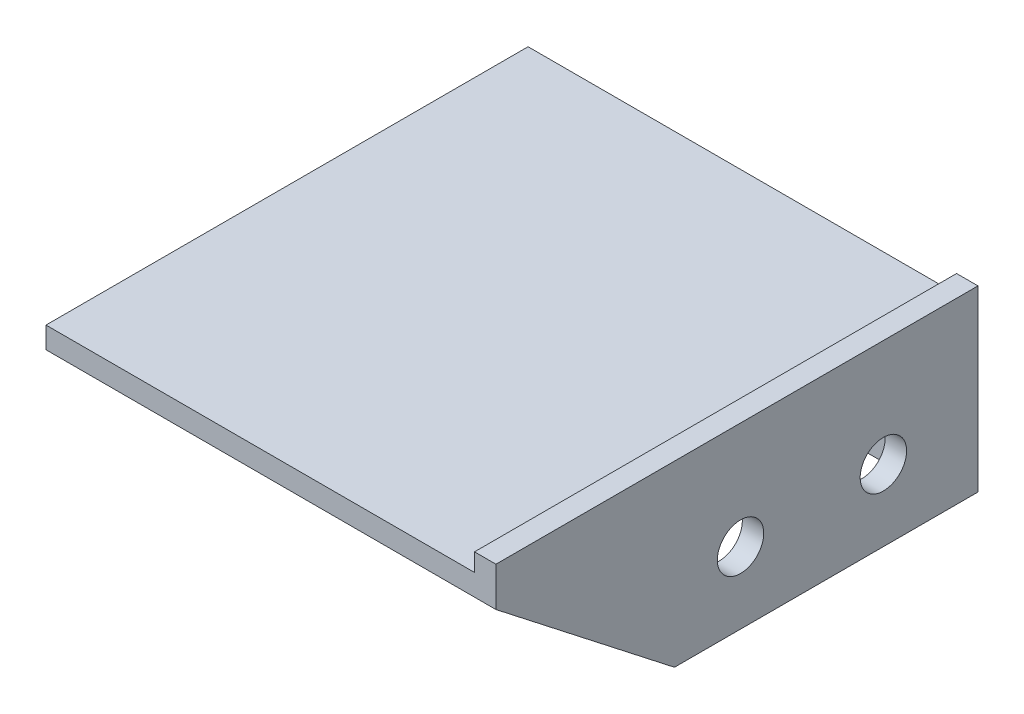
ISO-10303-21;
HEADER;
FILE_DESCRIPTION(('STEP AP214'),'2;1');
FILE_NAME('part.step','',(''),(''),'','','');
FILE_SCHEMA(('AUTOMOTIVE_DESIGN { 1 0 10303 214 1 1 1 1 }'));
ENDSEC;
DATA;
#1=APPLICATION_CONTEXT('core data for automotive mechanical design processes');
#2=APPLICATION_PROTOCOL_DEFINITION('international standard','automotive_design',2000,#1);
#3=PRODUCT_CONTEXT('',#1,'mechanical');
#4=PRODUCT('Part','Part','',(#3));
#5=PRODUCT_RELATED_PRODUCT_CATEGORY('part','',(#4));
#6=PRODUCT_DEFINITION_FORMATION('','',#4);
#7=PRODUCT_DEFINITION_CONTEXT('part definition',#1,'design');
#8=PRODUCT_DEFINITION('design','',#6,#7);
#9=PRODUCT_DEFINITION_SHAPE('','',#8);
#10=(LENGTH_UNIT() NAMED_UNIT(*) SI_UNIT(.MILLI.,.METRE.));
#11=(NAMED_UNIT(*) PLANE_ANGLE_UNIT() SI_UNIT($,.RADIAN.));
#12=(NAMED_UNIT(*) SI_UNIT($,.STERADIAN.) SOLID_ANGLE_UNIT());
#13=UNCERTAINTY_MEASURE_WITH_UNIT(LENGTH_MEASURE(1.E-05),#10,'distance_accuracy_value','');
#14=(GEOMETRIC_REPRESENTATION_CONTEXT(3) GLOBAL_UNCERTAINTY_ASSIGNED_CONTEXT((#13)) GLOBAL_UNIT_ASSIGNED_CONTEXT((#10,
#11,#12)) REPRESENTATION_CONTEXT('',''));
#15=CARTESIAN_POINT('',(0.,0.,0.));
#16=DIRECTION('',(0.,0.,1.));
#17=DIRECTION('',(1.,0.,0.));
#18=AXIS2_PLACEMENT_3D('',#15,#16,#17);
#19=CARTESIAN_POINT('',(0.,0.,0.));
#20=DIRECTION('',(0.,-1.,0.));
#21=DIRECTION('',(0.,0.,-1.));
#22=AXIS2_PLACEMENT_3D('',#19,#20,#21);
#23=PLANE('',#22);
#24=DIRECTION('',(0.,0.,1.));
#25=VECTOR('',#24,1.);
#26=CARTESIAN_POINT('',(0.,0.,0.));
#27=LINE('',#26,#25);
#28=CARTESIAN_POINT('',(0.,0.,-258.));
#29=VERTEX_POINT('',#28);
#30=CARTESIAN_POINT('',(0.,0.,0.));
#31=VERTEX_POINT('',#30);
#32=EDGE_CURVE('E164',#29,#31,#27,.T.);
#33=ORIENTED_EDGE('',*,*,#32,.F.);
#34=DIRECTION('',(1.,0.,0.));
#35=VECTOR('',#34,1.);
#36=CARTESIAN_POINT('',(0.,0.,-258.));
#37=LINE('',#36,#35);
#38=CARTESIAN_POINT('',(240.,0.,-258.));
#39=VERTEX_POINT('',#38);
#40=EDGE_CURVE('E200',#29,#39,#37,.T.);
#41=ORIENTED_EDGE('',*,*,#40,.T.);
#42=DIRECTION('',(0.,0.,-1.));
#43=VECTOR('',#42,1.);
#44=CARTESIAN_POINT('',(240.,0.,0.));
#45=LINE('',#44,#43);
#46=CARTESIAN_POINT('',(240.,0.,0.));
#47=VERTEX_POINT('',#46);
#48=EDGE_CURVE('E38',#47,#39,#45,.T.);
#49=ORIENTED_EDGE('',*,*,#48,.F.);
#50=DIRECTION('',(1.,0.,0.));
#51=VECTOR('',#50,1.);
#52=CARTESIAN_POINT('',(0.,0.,0.));
#53=LINE('',#52,#51);
#54=EDGE_CURVE('E125',#31,#47,#53,.T.);
#55=ORIENTED_EDGE('',*,*,#54,.F.);
#56=EDGE_LOOP('',(#33,#41,#49,#55));
#57=FACE_BOUND('',#56,.T.);
#58=ADVANCED_FACE('F34',(#57),#23,.T.);
#59=CARTESIAN_POINT('',(240.,0.,0.));
#60=DIRECTION('',(-1.,0.,0.));
#61=DIRECTION('',(0.,0.,1.));
#62=AXIS2_PLACEMENT_3D('',#59,#60,#61);
#63=PLANE('',#62);
#64=DIRECTION('',(0.,-0.615031798693877,-0.788502306017791));
#65=VECTOR('',#64,1.);
#66=CARTESIAN_POINT('',(240.,0.,0.));
#67=LINE('',#66,#65);
#68=CARTESIAN_POINT('',(240.,-78.,-99.9999999999999));
#69=VERTEX_POINT('',#68);
#70=EDGE_CURVE('E127',#47,#69,#67,.T.);
#71=ORIENTED_EDGE('',*,*,#70,.F.);
#72=ORIENTED_EDGE('',*,*,#48,.T.);
#73=DIRECTION('',(0.,1.,0.));
#74=VECTOR('',#73,1.);
#75=CARTESIAN_POINT('',(240.,-78.,-258.));
#76=LINE('',#75,#74);
#77=CARTESIAN_POINT('',(240.,-78.,-258.));
#78=VERTEX_POINT('',#77);
#79=EDGE_CURVE('E196',#78,#39,#76,.T.);
#80=ORIENTED_EDGE('',*,*,#79,.F.);
#81=DIRECTION('',(0.,0.,-1.));
#82=VECTOR('',#81,1.);
#83=CARTESIAN_POINT('',(240.,-78.,-270.));
#84=LINE('',#83,#82);
#85=EDGE_CURVE('E59',#69,#78,#84,.T.);
#86=ORIENTED_EDGE('',*,*,#85,.F.);
#87=EDGE_LOOP('',(#71,#72,#80,#86));
#88=FACE_BOUND('',#87,.T.);
#89=CARTESIAN_POINT('',(240.,-38.,-217.));
#90=DIRECTION('',(-1.,0.,0.));
#91=DIRECTION('',(0.,0.,1.));
#92=AXIS2_PLACEMENT_3D('',#89,#90,#91);
#93=CIRCLE('',#92,13.);
#94=CARTESIAN_POINT('',(240.,-38.,-204.));
#95=VERTEX_POINT('',#94);
#96=EDGE_CURVE('E265',#95,#95,#93,.T.);
#97=ORIENTED_EDGE('',*,*,#96,.F.);
#98=EDGE_LOOP('',(#97));
#99=FACE_BOUND('',#98,.T.);
#100=CARTESIAN_POINT('',(240.,-38.,-137.));
#101=DIRECTION('',(-1.,0.,0.));
#102=DIRECTION('',(0.,0.,1.));
#103=AXIS2_PLACEMENT_3D('',#100,#101,#102);
#104=CIRCLE('',#103,13.);
#105=CARTESIAN_POINT('',(240.,-38.,-124.));
#106=VERTEX_POINT('',#105);
#107=EDGE_CURVE('E259',#106,#106,#104,.T.);
#108=ORIENTED_EDGE('',*,*,#107,.F.);
#109=EDGE_LOOP('',(#108));
#110=FACE_BOUND('',#109,.T.);
#111=ADVANCED_FACE('F194',(#88,#99,#110),#63,.T.);
#112=CARTESIAN_POINT('',(0.,12.,0.));
#113=DIRECTION('',(1.,0.,0.));
#114=DIRECTION('',(0.,0.,-1.));
#115=AXIS2_PLACEMENT_3D('',#112,#113,#114);
#116=PLANE('',#115);
#117=DIRECTION('',(0.,-1.,0.));
#118=VECTOR('',#117,1.);
#119=CARTESIAN_POINT('',(0.,12.,-270.));
#120=LINE('',#119,#118);
#121=CARTESIAN_POINT('',(0.,12.,-270.));
#122=VERTEX_POINT('',#121);
#123=CARTESIAN_POINT('',(0.,-78.,-270.));
#124=VERTEX_POINT('',#123);
#125=EDGE_CURVE('E44',#122,#124,#120,.T.);
#126=ORIENTED_EDGE('',*,*,#125,.T.);
#127=DIRECTION('',(0.,0.,1.));
#128=VECTOR('',#127,1.);
#129=CARTESIAN_POINT('',(0.,-78.,-270.));
#130=LINE('',#129,#128);
#131=CARTESIAN_POINT('',(0.,-78.,-258.));
#132=VERTEX_POINT('',#131);
#133=EDGE_CURVE('E206',#124,#132,#130,.T.);
#134=ORIENTED_EDGE('',*,*,#133,.T.);
#135=DIRECTION('',(0.,1.,0.));
#136=VECTOR('',#135,1.);
#137=CARTESIAN_POINT('',(0.,-78.,-258.));
#138=LINE('',#137,#136);
#139=EDGE_CURVE('E203',#132,#29,#138,.T.);
#140=ORIENTED_EDGE('',*,*,#139,.T.);
#141=ORIENTED_EDGE('',*,*,#32,.T.);
#142=DIRECTION('',(0.,-1.,0.));
#143=VECTOR('',#142,1.);
#144=CARTESIAN_POINT('',(0.,12.,0.));
#145=LINE('',#144,#143);
#146=CARTESIAN_POINT('',(0.,12.,0.));
#147=VERTEX_POINT('',#146);
#148=EDGE_CURVE('E11',#147,#31,#145,.T.);
#149=ORIENTED_EDGE('',*,*,#148,.F.);
#150=DIRECTION('',(0.,0.,1.));
#151=VECTOR('',#150,1.);
#152=CARTESIAN_POINT('',(0.,12.,0.));
#153=LINE('',#152,#151);
#154=EDGE_CURVE('E155',#122,#147,#153,.T.);
#155=ORIENTED_EDGE('',*,*,#154,.F.);
#156=EDGE_LOOP('',(#126,#134,#140,#141,#149,#155));
#157=FACE_BOUND('',#156,.T.);
#158=ADVANCED_FACE('F36',(#157),#116,.F.);
#159=CARTESIAN_POINT('',(0.,12.,0.));
#160=DIRECTION('',(0.,0.,-1.));
#161=DIRECTION('',(-1.,0.,0.));
#162=AXIS2_PLACEMENT_3D('',#159,#160,#161);
#163=PLANE('',#162);
#164=ORIENTED_EDGE('',*,*,#54,.T.);
#165=DIRECTION('',(1.,0.,0.));
#166=VECTOR('',#165,1.);
#167=CARTESIAN_POINT('',(-2.50000000145967E-05,0.,0.));
#168=LINE('',#167,#166);
#169=CARTESIAN_POINT('',(252.,0.,0.));
#170=VERTEX_POINT('',#169);
#171=EDGE_CURVE('E112',#47,#170,#168,.T.);
#172=ORIENTED_EDGE('',*,*,#171,.T.);
#173=DIRECTION('',(0.,-1.,0.));
#174=VECTOR('',#173,1.);
#175=CARTESIAN_POINT('',(252.,22.,0.));
#176=LINE('',#175,#174);
#177=CARTESIAN_POINT('',(252.,22.,0.));
#178=VERTEX_POINT('',#177);
#179=EDGE_CURVE('E123',#178,#170,#176,.T.);
#180=ORIENTED_EDGE('',*,*,#179,.F.);
#181=DIRECTION('',(-1.,0.,0.));
#182=VECTOR('',#181,1.);
#183=CARTESIAN_POINT('',(252.,22.,0.));
#184=LINE('',#183,#182);
#185=CARTESIAN_POINT('',(240.,22.,0.));
#186=VERTEX_POINT('',#185);
#187=EDGE_CURVE('E161',#178,#186,#184,.T.);
#188=ORIENTED_EDGE('',*,*,#187,.T.);
#189=DIRECTION('',(0.,-1.,0.));
#190=VECTOR('',#189,1.);
#191=CARTESIAN_POINT('',(240.,22.,0.));
#192=LINE('',#191,#190);
#193=CARTESIAN_POINT('',(240.,12.,0.));
#194=VERTEX_POINT('',#193);
#195=EDGE_CURVE('E152',#186,#194,#192,.T.);
#196=ORIENTED_EDGE('',*,*,#195,.T.);
#197=DIRECTION('',(1.,0.,0.));
#198=VECTOR('',#197,1.);
#199=CARTESIAN_POINT('',(0.,12.,0.));
#200=LINE('',#199,#198);
#201=EDGE_CURVE('E180',#147,#194,#200,.T.);
#202=ORIENTED_EDGE('',*,*,#201,.F.);
#203=ORIENTED_EDGE('',*,*,#148,.T.);
#204=EDGE_LOOP('',(#164,#172,#180,#188,#196,#202,#203));
#205=FACE_BOUND('',#204,.T.);
#206=ADVANCED_FACE('F121',(#205),#163,.F.);
#207=CARTESIAN_POINT('',(0.,12.,-270.));
#208=DIRECTION('',(0.,0.,1.));
#209=DIRECTION('',(1.,0.,0.));
#210=AXIS2_PLACEMENT_3D('',#207,#208,#209);
#211=PLANE('',#210);
#212=CARTESIAN_POINT('',(158.,-38.,-270.));
#213=DIRECTION('',(0.,0.,1.));
#214=DIRECTION('',(1.,0.,0.));
#215=AXIS2_PLACEMENT_3D('',#212,#213,#214);
#216=CIRCLE('',#215,13.);
#217=CARTESIAN_POINT('',(171.,-38.,-270.));
#218=VERTEX_POINT('',#217);
#219=EDGE_CURVE('E253',#218,#218,#216,.T.);
#220=ORIENTED_EDGE('',*,*,#219,.T.);
#221=EDGE_LOOP('',(#220));
#222=FACE_BOUND('',#221,.T.);
#223=CARTESIAN_POINT('',(38.,-38.,-270.));
#224=DIRECTION('',(0.,0.,1.));
#225=DIRECTION('',(1.,0.,0.));
#226=AXIS2_PLACEMENT_3D('',#223,#224,#225);
#227=CIRCLE('',#226,13.);
#228=CARTESIAN_POINT('',(51.,-38.,-270.));
#229=VERTEX_POINT('',#228);
#230=EDGE_CURVE('E246',#229,#229,#227,.T.);
#231=ORIENTED_EDGE('',*,*,#230,.T.);
#232=EDGE_LOOP('',(#231));
#233=FACE_BOUND('',#232,.T.);
#234=DIRECTION('',(-1.,0.,0.));
#235=VECTOR('',#234,1.);
#236=CARTESIAN_POINT('',(252.,-78.,-270.));
#237=LINE('',#236,#235);
#238=CARTESIAN_POINT('',(252.,-78.,-270.));
#239=VERTEX_POINT('',#238);
#240=EDGE_CURVE('E135',#239,#124,#237,.T.);
#241=ORIENTED_EDGE('',*,*,#240,.T.);
#242=ORIENTED_EDGE('',*,*,#125,.F.);
#243=DIRECTION('',(-1.,0.,0.));
#244=VECTOR('',#243,1.);
#245=CARTESIAN_POINT('',(0.,12.,-270.));
#246=LINE('',#245,#244);
#247=CARTESIAN_POINT('',(240.,12.,-270.));
#248=VERTEX_POINT('',#247);
#249=EDGE_CURVE('E175',#248,#122,#246,.T.);
#250=ORIENTED_EDGE('',*,*,#249,.F.);
#251=DIRECTION('',(0.,1.,0.));
#252=VECTOR('',#251,1.);
#253=CARTESIAN_POINT('',(240.,22.,-270.));
#254=LINE('',#253,#252);
#255=CARTESIAN_POINT('',(240.,22.,-270.));
#256=VERTEX_POINT('',#255);
#257=EDGE_CURVE('E146',#248,#256,#254,.T.);
#258=ORIENTED_EDGE('',*,*,#257,.T.);
#259=DIRECTION('',(-1.,0.,0.));
#260=VECTOR('',#259,1.);
#261=CARTESIAN_POINT('',(252.,22.,-270.));
#262=LINE('',#261,#260);
#263=CARTESIAN_POINT('',(252.,22.,-270.));
#264=VERTEX_POINT('',#263);
#265=EDGE_CURVE('E150',#264,#256,#262,.T.);
#266=ORIENTED_EDGE('',*,*,#265,.F.);
#267=DIRECTION('',(0.,1.,0.));
#268=VECTOR('',#267,1.);
#269=CARTESIAN_POINT('',(252.,22.,-270.));
#270=LINE('',#269,#268);
#271=EDGE_CURVE('E137',#239,#264,#270,.T.);
#272=ORIENTED_EDGE('',*,*,#271,.F.);
#273=EDGE_LOOP('',(#241,#242,#250,#258,#266,#272));
#274=FACE_BOUND('',#273,.T.);
#275=ADVANCED_FACE('F212',(#222,#233,#274),#211,.F.);
#276=CARTESIAN_POINT('',(0.,12.,0.));
#277=DIRECTION('',(0.,-1.,0.));
#278=DIRECTION('',(0.,0.,-1.));
#279=AXIS2_PLACEMENT_3D('',#276,#277,#278);
#280=PLANE('',#279);
#281=ORIENTED_EDGE('',*,*,#154,.T.);
#282=ORIENTED_EDGE('',*,*,#201,.T.);
#283=DIRECTION('',(0.,0.,-1.));
#284=VECTOR('',#283,1.);
#285=CARTESIAN_POINT('',(240.,12.,0.));
#286=LINE('',#285,#284);
#287=EDGE_CURVE('E177',#194,#248,#286,.T.);
#288=ORIENTED_EDGE('',*,*,#287,.T.);
#289=ORIENTED_EDGE('',*,*,#249,.T.);
#290=EDGE_LOOP('',(#281,#282,#288,#289));
#291=FACE_BOUND('',#290,.T.);
#292=ADVANCED_FACE('F227',(#291),#280,.F.);
#293=ORIENTED_EDGE('',*,*,#287,.F.);
#294=ORIENTED_EDGE('',*,*,#195,.F.);
#295=DIRECTION('',(0.,0.,1.));
#296=VECTOR('',#295,1.);
#297=CARTESIAN_POINT('',(240.,22.,-270.));
#298=LINE('',#297,#296);
#299=EDGE_CURVE('E143',#256,#186,#298,.T.);
#300=ORIENTED_EDGE('',*,*,#299,.F.);
#301=ORIENTED_EDGE('',*,*,#257,.F.);
#302=EDGE_LOOP('',(#293,#294,#300,#301));
#303=FACE_BOUND('',#302,.T.);
#304=ADVANCED_FACE('F217',(#303),#63,.T.);
#305=CARTESIAN_POINT('',(252.,22.,-270.));
#306=DIRECTION('',(0.,-1.,0.));
#307=DIRECTION('',(0.,0.,-1.));
#308=AXIS2_PLACEMENT_3D('',#305,#306,#307);
#309=PLANE('',#308);
#310=ORIENTED_EDGE('',*,*,#299,.T.);
#311=ORIENTED_EDGE('',*,*,#187,.F.);
#312=DIRECTION('',(0.,0.,1.));
#313=VECTOR('',#312,1.);
#314=CARTESIAN_POINT('',(252.,22.,-270.));
#315=LINE('',#314,#313);
#316=EDGE_CURVE('E131',#264,#178,#315,.T.);
#317=ORIENTED_EDGE('',*,*,#316,.F.);
#318=ORIENTED_EDGE('',*,*,#265,.T.);
#319=EDGE_LOOP('',(#310,#311,#317,#318));
#320=FACE_BOUND('',#319,.T.);
#321=ADVANCED_FACE('F218',(#320),#309,.F.);
#322=CARTESIAN_POINT('',(252.,-78.,-270.));
#323=DIRECTION('',(0.,1.,0.));
#324=DIRECTION('',(0.,0.,1.));
#325=AXIS2_PLACEMENT_3D('',#322,#323,#324);
#326=PLANE('',#325);
#327=DIRECTION('',(0.,0.,-1.));
#328=VECTOR('',#327,1.);
#329=CARTESIAN_POINT('',(252.,-78.,-270.));
#330=LINE('',#329,#328);
#331=CARTESIAN_POINT('',(252.,-78.,-99.9999999999999));
#332=VERTEX_POINT('',#331);
#333=EDGE_CURVE('E133',#332,#239,#330,.T.);
#334=ORIENTED_EDGE('',*,*,#333,.F.);
#335=DIRECTION('',(1.,0.,0.));
#336=VECTOR('',#335,1.);
#337=CARTESIAN_POINT('',(-2.50000000145967E-05,-78.,-99.9999999999999));
#338=LINE('',#337,#336);
#339=EDGE_CURVE('E52',#69,#332,#338,.T.);
#340=ORIENTED_EDGE('',*,*,#339,.F.);
#341=ORIENTED_EDGE('',*,*,#85,.T.);
#342=DIRECTION('',(1.,0.,0.));
#343=VECTOR('',#342,1.);
#344=CARTESIAN_POINT('',(0.,-78.,-258.));
#345=LINE('',#344,#343);
#346=EDGE_CURVE('E149',#132,#78,#345,.T.);
#347=ORIENTED_EDGE('',*,*,#346,.F.);
#348=ORIENTED_EDGE('',*,*,#133,.F.);
#349=ORIENTED_EDGE('',*,*,#240,.F.);
#350=EDGE_LOOP('',(#334,#340,#341,#347,#348,#349));
#351=FACE_BOUND('',#350,.T.);
#352=ADVANCED_FACE('F220',(#351),#326,.F.);
#353=CARTESIAN_POINT('',(252.,0.,0.));
#354=DIRECTION('',(-1.,0.,0.));
#355=DIRECTION('',(0.,0.,1.));
#356=AXIS2_PLACEMENT_3D('',#353,#354,#355);
#357=PLANE('',#356);
#358=CARTESIAN_POINT('',(252.,-38.,-217.));
#359=DIRECTION('',(1.,0.,0.));
#360=DIRECTION('',(0.,0.,-1.));
#361=AXIS2_PLACEMENT_3D('',#358,#359,#360);
#362=CIRCLE('',#361,13.);
#363=CARTESIAN_POINT('',(252.,-38.,-230.));
#364=VERTEX_POINT('',#363);
#365=EDGE_CURVE('E268',#364,#364,#362,.T.);
#366=ORIENTED_EDGE('',*,*,#365,.F.);
#367=EDGE_LOOP('',(#366));
#368=FACE_BOUND('',#367,.T.);
#369=CARTESIAN_POINT('',(252.,-38.,-137.));
#370=DIRECTION('',(1.,0.,0.));
#371=DIRECTION('',(0.,0.,-1.));
#372=AXIS2_PLACEMENT_3D('',#369,#370,#371);
#373=CIRCLE('',#372,13.);
#374=CARTESIAN_POINT('',(252.,-38.,-150.));
#375=VERTEX_POINT('',#374);
#376=EDGE_CURVE('E262',#375,#375,#373,.T.);
#377=ORIENTED_EDGE('',*,*,#376,.F.);
#378=EDGE_LOOP('',(#377));
#379=FACE_BOUND('',#378,.T.);
#380=ORIENTED_EDGE('',*,*,#179,.T.);
#381=DIRECTION('',(0.,0.615031798693877,0.788502306017791));
#382=VECTOR('',#381,1.);
#383=CARTESIAN_POINT('',(252.,0.,0.));
#384=LINE('',#383,#382);
#385=EDGE_CURVE('E109',#332,#170,#384,.T.);
#386=ORIENTED_EDGE('',*,*,#385,.F.);
#387=ORIENTED_EDGE('',*,*,#333,.T.);
#388=ORIENTED_EDGE('',*,*,#271,.T.);
#389=ORIENTED_EDGE('',*,*,#316,.T.);
#390=EDGE_LOOP('',(#380,#386,#387,#388,#389));
#391=FACE_BOUND('',#390,.T.);
#392=ADVANCED_FACE('F129',(#368,#379,#391),#357,.F.);
#393=CARTESIAN_POINT('',(0.,-78.,-258.));
#394=DIRECTION('',(0.,0.,-1.));
#395=DIRECTION('',(-1.,0.,0.));
#396=AXIS2_PLACEMENT_3D('',#393,#394,#395);
#397=PLANE('',#396);
#398=CARTESIAN_POINT('',(158.,-38.,-258.));
#399=DIRECTION('',(0.,0.,1.));
#400=DIRECTION('',(1.,0.,0.));
#401=AXIS2_PLACEMENT_3D('',#398,#399,#400);
#402=CIRCLE('',#401,13.);
#403=CARTESIAN_POINT('',(171.,-38.,-258.));
#404=VERTEX_POINT('',#403);
#405=EDGE_CURVE('E256',#404,#404,#402,.T.);
#406=ORIENTED_EDGE('',*,*,#405,.F.);
#407=EDGE_LOOP('',(#406));
#408=FACE_BOUND('',#407,.T.);
#409=CARTESIAN_POINT('',(38.,-38.,-258.));
#410=DIRECTION('',(0.,0.,1.));
#411=DIRECTION('',(1.,0.,0.));
#412=AXIS2_PLACEMENT_3D('',#409,#410,#411);
#413=CIRCLE('',#412,13.);
#414=CARTESIAN_POINT('',(51.,-38.,-258.));
#415=VERTEX_POINT('',#414);
#416=EDGE_CURVE('E250',#415,#415,#413,.T.);
#417=ORIENTED_EDGE('',*,*,#416,.F.);
#418=EDGE_LOOP('',(#417));
#419=FACE_BOUND('',#418,.T.);
#420=ORIENTED_EDGE('',*,*,#79,.T.);
#421=ORIENTED_EDGE('',*,*,#40,.F.);
#422=ORIENTED_EDGE('',*,*,#139,.F.);
#423=ORIENTED_EDGE('',*,*,#346,.T.);
#424=EDGE_LOOP('',(#420,#421,#422,#423));
#425=FACE_BOUND('',#424,.T.);
#426=ADVANCED_FACE('F282',(#408,#419,#425),#397,.F.);
#427=CARTESIAN_POINT('',(38.,-38.,-270.00005));
#428=DIRECTION('',(0.,0.,1.));
#429=DIRECTION('',(1.,0.,0.));
#430=AXIS2_PLACEMENT_3D('',#427,#428,#429);
#431=CYLINDRICAL_SURFACE('',#430,13.);
#432=ORIENTED_EDGE('',*,*,#416,.T.);
#433=EDGE_LOOP('',(#432));
#434=FACE_BOUND('',#433,.T.);
#435=ORIENTED_EDGE('',*,*,#230,.F.);
#436=EDGE_LOOP('',(#435));
#437=FACE_BOUND('',#436,.T.);
#438=ADVANCED_FACE('F297',(#434,#437),#431,.F.);
#439=CARTESIAN_POINT('',(158.,-38.,-270.00005));
#440=DIRECTION('',(0.,0.,1.));
#441=DIRECTION('',(1.,0.,0.));
#442=AXIS2_PLACEMENT_3D('',#439,#440,#441);
#443=CYLINDRICAL_SURFACE('',#442,13.);
#444=ORIENTED_EDGE('',*,*,#405,.T.);
#445=EDGE_LOOP('',(#444));
#446=FACE_BOUND('',#445,.T.);
#447=ORIENTED_EDGE('',*,*,#219,.F.);
#448=EDGE_LOOP('',(#447));
#449=FACE_BOUND('',#448,.T.);
#450=ADVANCED_FACE('F288',(#446,#449),#443,.F.);
#451=CARTESIAN_POINT('',(-2.50000000145967E-05,-38.,-137.));
#452=DIRECTION('',(1.,0.,0.));
#453=DIRECTION('',(0.,0.,-1.));
#454=AXIS2_PLACEMENT_3D('',#451,#452,#453);
#455=CYLINDRICAL_SURFACE('',#454,13.);
#456=ORIENTED_EDGE('',*,*,#107,.T.);
#457=EDGE_LOOP('',(#456));
#458=FACE_BOUND('',#457,.T.);
#459=ORIENTED_EDGE('',*,*,#376,.T.);
#460=EDGE_LOOP('',(#459));
#461=FACE_BOUND('',#460,.T.);
#462=ADVANCED_FACE('F286',(#458,#461),#455,.F.);
#463=CARTESIAN_POINT('',(-2.50000000145967E-05,-38.,-217.));
#464=DIRECTION('',(1.,0.,0.));
#465=DIRECTION('',(0.,0.,-1.));
#466=AXIS2_PLACEMENT_3D('',#463,#464,#465);
#467=CYLINDRICAL_SURFACE('',#466,13.);
#468=ORIENTED_EDGE('',*,*,#96,.T.);
#469=EDGE_LOOP('',(#468));
#470=FACE_BOUND('',#469,.T.);
#471=ORIENTED_EDGE('',*,*,#365,.T.);
#472=EDGE_LOOP('',(#471));
#473=FACE_BOUND('',#472,.T.);
#474=ADVANCED_FACE('F278',(#470,#473),#467,.F.);
#475=CARTESIAN_POINT('',(-2.50000000145967E-05,0.,0.));
#476=DIRECTION('',(0.,0.788502306017791,-0.615031798693877));
#477=DIRECTION('',(0.,0.615031798693877,0.788502306017791));
#478=AXIS2_PLACEMENT_3D('',#475,#476,#477);
#479=PLANE('',#478);
#480=ORIENTED_EDGE('',*,*,#70,.T.);
#481=ORIENTED_EDGE('',*,*,#339,.T.);
#482=ORIENTED_EDGE('',*,*,#385,.T.);
#483=ORIENTED_EDGE('',*,*,#171,.F.);
#484=EDGE_LOOP('',(#480,#481,#482,#483));
#485=FACE_BOUND('',#484,.T.);
#486=ADVANCED_FACE('F111',(#485),#479,.F.);
#487=CLOSED_SHELL('',(#58,#111,#158,#206,#275,#292,#304,#321,#352,#392,#426,#438,#450,#462,#474,#486));
#488=MANIFOLD_SOLID_BREP('B2',#487);
#489=ADVANCED_BREP_SHAPE_REPRESENTATION('',(#18,#488),#14);
#490=SHAPE_DEFINITION_REPRESENTATION(#9,#489);
ENDSEC;
END-ISO-10303-21;
